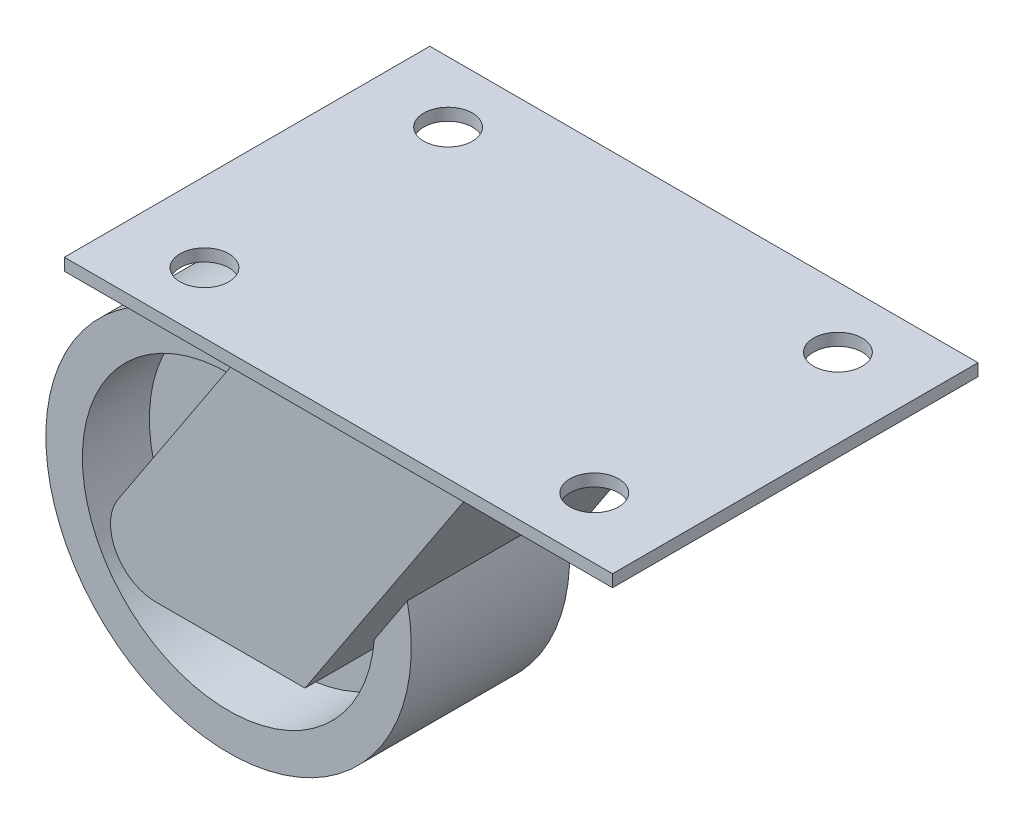
ISO-10303-21;
HEADER;
FILE_DESCRIPTION(('STEP AP214'),'2;1');
FILE_NAME('part.step','',(''),(''),'','','');
FILE_SCHEMA(('AUTOMOTIVE_DESIGN { 1 0 10303 214 1 1 1 1 }'));
ENDSEC;
DATA;
#1=APPLICATION_CONTEXT('core data for automotive mechanical design processes');
#2=APPLICATION_PROTOCOL_DEFINITION('international standard','automotive_design',2000,#1);
#3=PRODUCT_CONTEXT('',#1,'mechanical');
#4=PRODUCT('Part','Part','',(#3));
#5=PRODUCT_RELATED_PRODUCT_CATEGORY('part','',(#4));
#6=PRODUCT_DEFINITION_FORMATION('','',#4);
#7=PRODUCT_DEFINITION_CONTEXT('part definition',#1,'design');
#8=PRODUCT_DEFINITION('design','',#6,#7);
#9=PRODUCT_DEFINITION_SHAPE('','',#8);
#10=(LENGTH_UNIT() NAMED_UNIT(*) SI_UNIT(.MILLI.,.METRE.));
#11=(NAMED_UNIT(*) PLANE_ANGLE_UNIT() SI_UNIT($,.RADIAN.));
#12=(NAMED_UNIT(*) SI_UNIT($,.STERADIAN.) SOLID_ANGLE_UNIT());
#13=UNCERTAINTY_MEASURE_WITH_UNIT(LENGTH_MEASURE(1.E-05),#10,'distance_accuracy_value','');
#14=(GEOMETRIC_REPRESENTATION_CONTEXT(3) GLOBAL_UNCERTAINTY_ASSIGNED_CONTEXT((#13)) GLOBAL_UNIT_ASSIGNED_CONTEXT((#10,
#11,#12)) REPRESENTATION_CONTEXT('',''));
#15=CARTESIAN_POINT('',(0.,0.,0.));
#16=DIRECTION('',(0.,0.,1.));
#17=DIRECTION('',(1.,0.,0.));
#18=AXIS2_PLACEMENT_3D('',#15,#16,#17);
#19=CARTESIAN_POINT('',(10.7769033072078,-2.75667119831269,-11.));
#20=DIRECTION('',(0.835073819861632,-0.550137905785179,0.));
#21=DIRECTION('',(0.550137905785179,0.835073819861632,0.));
#22=AXIS2_PLACEMENT_3D('',#19,#20,#21);
#23=PLANE('',#22);
#24=DIRECTION('',(0.550137905785179,0.835073819861632,0.));
#25=VECTOR('',#24,1.);
#26=CARTESIAN_POINT('',(10.7769033072078,-2.75667119831269,-11.));
#27=LINE('',#26,#25);
#28=CARTESIAN_POINT('',(10.7769033072078,-2.75667119831269,-11.));
#29=VERTEX_POINT('',#28);
#30=CARTESIAN_POINT('',(26.4275500292333,21.,-11.));
#31=VERTEX_POINT('',#30);
#32=EDGE_CURVE('E279',#29,#31,#27,.T.);
#33=ORIENTED_EDGE('',*,*,#32,.T.);
#34=DIRECTION('',(0.,0.,1.));
#35=VECTOR('',#34,1.);
#36=CARTESIAN_POINT('',(26.4275500292333,21.,-11.));
#37=LINE('',#36,#35);
#38=CARTESIAN_POINT('',(26.4275500292333,21.,11.));
#39=VERTEX_POINT('',#38);
#40=EDGE_CURVE('E260',#31,#39,#37,.T.);
#41=ORIENTED_EDGE('',*,*,#40,.T.);
#42=DIRECTION('',(0.550137905785179,0.835073819861632,0.));
#43=VECTOR('',#42,1.);
#44=CARTESIAN_POINT('',(10.7769033072078,-2.75667119831269,11.));
#45=LINE('',#44,#43);
#46=CARTESIAN_POINT('',(10.7769033072078,-2.75667119831269,11.));
#47=VERTEX_POINT('',#46);
#48=EDGE_CURVE('E272',#47,#39,#45,.T.);
#49=ORIENTED_EDGE('',*,*,#48,.F.);
#50=DIRECTION('',(0.,0.,1.));
#51=VECTOR('',#50,1.);
#52=CARTESIAN_POINT('',(10.7769033072078,-2.75667119831269,-11.));
#53=LINE('',#52,#51);
#54=CARTESIAN_POINT('',(10.7769033072078,-2.75667119831269,1.));
#55=VERTEX_POINT('',#54);
#56=EDGE_CURVE('E302',#55,#47,#53,.T.);
#57=ORIENTED_EDGE('',*,*,#56,.F.);
#58=DIRECTION('',(0.550137905785179,0.835073819861632,0.));
#59=VECTOR('',#58,1.);
#60=CARTESIAN_POINT('',(8.78168566842124,-5.78528274744558,1.));
#61=LINE('',#60,#59);
#62=CARTESIAN_POINT('',(11.9616778927944,-0.958259875521329,1.));
#63=VERTEX_POINT('',#62);
#64=EDGE_CURVE('E60',#55,#63,#61,.T.);
#65=ORIENTED_EDGE('',*,*,#64,.T.);
#66=DIRECTION('',(0.,0.,-1.));
#67=VECTOR('',#66,1.);
#68=CARTESIAN_POINT('',(11.9616778927944,-0.958259875521333,6.5));
#69=LINE('',#68,#67);
#70=CARTESIAN_POINT('',(11.9616778927944,-0.958259875521333,6.5));
#71=VERTEX_POINT('',#70);
#72=EDGE_CURVE('E366',#63,#71,#69,.F.);
#73=ORIENTED_EDGE('',*,*,#72,.T.);
#74=DIRECTION('',(0.550137905785179,0.835073819861632,0.));
#75=VECTOR('',#74,1.);
#76=CARTESIAN_POINT('',(8.78168566842124,-5.78528274744558,6.5));
#77=LINE('',#76,#75);
#78=CARTESIAN_POINT('',(14.666168610277,3.14698241096535,6.5));
#79=VERTEX_POINT('',#78);
#80=EDGE_CURVE('E369',#71,#79,#77,.T.);
#81=ORIENTED_EDGE('',*,*,#80,.T.);
#82=DIRECTION('',(0.,0.,-1.));
#83=VECTOR('',#82,1.);
#84=CARTESIAN_POINT('',(14.666168610277,3.14698241096535,6.5));
#85=LINE('',#84,#83);
#86=CARTESIAN_POINT('',(14.666168610277,3.14698241096535,-6.5));
#87=VERTEX_POINT('',#86);
#88=EDGE_CURVE('E372',#87,#79,#85,.F.);
#89=ORIENTED_EDGE('',*,*,#88,.F.);
#90=DIRECTION('',(0.550137905785179,0.835073819861632,0.));
#91=VECTOR('',#90,1.);
#92=CARTESIAN_POINT('',(8.78168566842124,-5.78528274744558,-6.5));
#93=LINE('',#92,#91);
#94=CARTESIAN_POINT('',(11.9616778927944,-0.958259875521329,-6.5));
#95=VERTEX_POINT('',#94);
#96=EDGE_CURVE('E376',#95,#87,#93,.T.);
#97=ORIENTED_EDGE('',*,*,#96,.F.);
#98=DIRECTION('',(0.,0.,-1.));
#99=VECTOR('',#98,1.);
#100=CARTESIAN_POINT('',(11.9616778927944,-0.958259875521333,6.5));
#101=LINE('',#100,#99);
#102=CARTESIAN_POINT('',(11.9616778927944,-0.958259875521333,-1.));
#103=VERTEX_POINT('',#102);
#104=EDGE_CURVE('E380',#95,#103,#101,.F.);
#105=ORIENTED_EDGE('',*,*,#104,.T.);
#106=DIRECTION('',(0.550137905785179,0.835073819861632,0.));
#107=VECTOR('',#106,1.);
#108=CARTESIAN_POINT('',(8.78168566842124,-5.78528274744558,-1.));
#109=LINE('',#108,#107);
#110=CARTESIAN_POINT('',(10.7769033072078,-2.75667119831269,-1.));
#111=VERTEX_POINT('',#110);
#112=EDGE_CURVE('E383',#111,#103,#109,.T.);
#113=ORIENTED_EDGE('',*,*,#112,.F.);
#114=EDGE_CURVE('E297',#29,#111,#53,.T.);
#115=ORIENTED_EDGE('',*,*,#114,.F.);
#116=EDGE_LOOP('',(#33,#41,#49,#57,#65,#73,#81,#89,#97,#105,#113,#115));
#117=FACE_BOUND('',#116,.T.);
#118=ADVANCED_FACE('F51',(#117),#23,.T.);
#119=CARTESIAN_POINT('',(-4.58185860778798,2.97795286723007,-11.));
#120=DIRECTION('',(-0.835073819861632,0.550137905785179,0.));
#121=DIRECTION('',(-0.550137905785179,-0.835073819861632,0.));
#122=AXIS2_PLACEMENT_3D('',#119,#120,#121);
#123=PLANE('',#122);
#124=DIRECTION('',(-0.550137905785179,-0.835073819861632,0.));
#125=VECTOR('',#124,1.);
#126=CARTESIAN_POINT('',(-4.58185860778798,2.97795286723007,11.));
#127=LINE('',#126,#125);
#128=CARTESIAN_POINT('',(7.29087770817826,21.,11.));
#129=VERTEX_POINT('',#128);
#130=CARTESIAN_POINT('',(-4.58185860778798,2.97795286723007,11.));
#131=VERTEX_POINT('',#130);
#132=EDGE_CURVE('E267',#129,#131,#127,.T.);
#133=ORIENTED_EDGE('',*,*,#132,.F.);
#134=DIRECTION('',(0.,0.,-1.));
#135=VECTOR('',#134,1.);
#136=CARTESIAN_POINT('',(7.29087770817826,21.,-11.));
#137=LINE('',#136,#135);
#138=CARTESIAN_POINT('',(7.29087770817826,21.,-11.));
#139=VERTEX_POINT('',#138);
#140=EDGE_CURVE('E67',#129,#139,#137,.T.);
#141=ORIENTED_EDGE('',*,*,#140,.T.);
#142=DIRECTION('',(-0.550137905785179,-0.835073819861632,0.));
#143=VECTOR('',#142,1.);
#144=CARTESIAN_POINT('',(-4.58185860778798,2.97795286723007,-11.));
#145=LINE('',#144,#143);
#146=CARTESIAN_POINT('',(-4.58185860778798,2.97795286723007,-11.));
#147=VERTEX_POINT('',#146);
#148=EDGE_CURVE('E268',#139,#147,#145,.T.);
#149=ORIENTED_EDGE('',*,*,#148,.T.);
#150=DIRECTION('',(0.,0.,1.));
#151=VECTOR('',#150,1.);
#152=CARTESIAN_POINT('',(-4.58185860778798,2.97795286723007,-11.));
#153=LINE('',#152,#151);
#154=CARTESIAN_POINT('',(-4.58185860778798,2.97795286723007,-1.));
#155=VERTEX_POINT('',#154);
#156=EDGE_CURVE('E306',#147,#155,#153,.T.);
#157=ORIENTED_EDGE('',*,*,#156,.T.);
#158=DIRECTION('',(-0.550137905785179,-0.835073819861632,0.));
#159=VECTOR('',#158,1.);
#160=CARTESIAN_POINT('',(-4.56323994796898,3.00621479067191,-1.));
#161=LINE('',#160,#159);
#162=CARTESIAN_POINT('',(1.31421865650546,11.927817458483,-1.));
#163=VERTEX_POINT('',#162);
#164=EDGE_CURVE('E362',#163,#155,#161,.T.);
#165=ORIENTED_EDGE('',*,*,#164,.F.);
#166=DIRECTION('',(0.,0.,-1.));
#167=VECTOR('',#166,1.);
#168=CARTESIAN_POINT('',(1.31421865650546,11.927817458483,6.5));
#169=LINE('',#168,#167);
#170=CARTESIAN_POINT('',(1.31421865650547,11.927817458483,-6.5));
#171=VERTEX_POINT('',#170);
#172=EDGE_CURVE('E359',#163,#171,#169,.T.);
#173=ORIENTED_EDGE('',*,*,#172,.T.);
#174=DIRECTION('',(-0.550137905785179,-0.835073819861632,0.));
#175=VECTOR('',#174,1.);
#176=CARTESIAN_POINT('',(-4.56323994796898,3.00621479067191,-6.5));
#177=LINE('',#176,#175);
#178=CARTESIAN_POINT('',(3.12176549075575,14.6715568437956,-6.5));
#179=VERTEX_POINT('',#178);
#180=EDGE_CURVE('E355',#179,#171,#177,.T.);
#181=ORIENTED_EDGE('',*,*,#180,.F.);
#182=DIRECTION('',(0.,0.,-1.));
#183=VECTOR('',#182,1.);
#184=CARTESIAN_POINT('',(3.12176549075575,14.6715568437956,6.5));
#185=LINE('',#184,#183);
#186=CARTESIAN_POINT('',(3.12176549075575,14.6715568437956,6.5));
#187=VERTEX_POINT('',#186);
#188=EDGE_CURVE('E351',#187,#179,#185,.T.);
#189=ORIENTED_EDGE('',*,*,#188,.F.);
#190=DIRECTION('',(-0.550137905785179,-0.835073819861632,0.));
#191=VECTOR('',#190,1.);
#192=CARTESIAN_POINT('',(-4.56323994796898,3.00621479067191,6.5));
#193=LINE('',#192,#191);
#194=CARTESIAN_POINT('',(1.31421865650546,11.927817458483,6.5));
#195=VERTEX_POINT('',#194);
#196=EDGE_CURVE('E348',#187,#195,#193,.T.);
#197=ORIENTED_EDGE('',*,*,#196,.T.);
#198=DIRECTION('',(0.,0.,-1.));
#199=VECTOR('',#198,1.);
#200=CARTESIAN_POINT('',(1.31421865650546,11.927817458483,6.5));
#201=LINE('',#200,#199);
#202=CARTESIAN_POINT('',(1.31421865650547,11.927817458483,1.));
#203=VERTEX_POINT('',#202);
#204=EDGE_CURVE('E345',#195,#203,#201,.T.);
#205=ORIENTED_EDGE('',*,*,#204,.T.);
#206=DIRECTION('',(-0.550137905785179,-0.835073819861632,0.));
#207=VECTOR('',#206,1.);
#208=CARTESIAN_POINT('',(-4.56323994796898,3.00621479067191,1.));
#209=LINE('',#208,#207);
#210=CARTESIAN_POINT('',(-4.58185860778798,2.97795286723007,1.));
#211=VERTEX_POINT('',#210);
#212=EDGE_CURVE('E435',#203,#211,#209,.T.);
#213=ORIENTED_EDGE('',*,*,#212,.T.);
#214=EDGE_CURVE('E283',#211,#131,#153,.T.);
#215=ORIENTED_EDGE('',*,*,#214,.T.);
#216=EDGE_LOOP('',(#133,#141,#149,#157,#165,#173,#181,#189,#197,#205,#213,#215));
#217=FACE_BOUND('',#216,.T.);
#218=ADVANCED_FACE('F458',(#217),#123,.T.);
#219=CARTESIAN_POINT('',(0.,0.,-11.));
#220=DIRECTION('',(0.,0.,1.));
#221=DIRECTION('',(1.,0.,0.));
#222=AXIS2_PLACEMENT_3D('',#219,#220,#221);
#223=PLANE('',#222);
#224=DIRECTION('',(-1.,0.,0.));
#225=VECTOR('',#224,1.);
#226=CARTESIAN_POINT('',(0.,21.,-11.));
#227=LINE('',#226,#225);
#228=EDGE_CURVE('E264',#31,#139,#227,.T.);
#229=ORIENTED_EDGE('',*,*,#228,.F.);
#230=ORIENTED_EDGE('',*,*,#32,.F.);
#231=DIRECTION('',(1.,0.,0.));
#232=VECTOR('',#231,1.);
#233=CARTESIAN_POINT('',(-1.49256287093057,-2.75667119831269,-11.));
#234=LINE('',#233,#232);
#235=CARTESIAN_POINT('',(-1.49256287093057,-2.75667119831269,-11.));
#236=VERTEX_POINT('',#235);
#237=EDGE_CURVE('E275',#236,#29,#234,.T.);
#238=ORIENTED_EDGE('',*,*,#237,.F.);
#239=CARTESIAN_POINT('',(-1.49256287093057,0.94275711973624,-11.));
#240=DIRECTION('',(0.,0.,1.));
#241=DIRECTION('',(-1.,0.,0.));
#242=AXIS2_PLACEMENT_3D('',#239,#240,#241);
#243=CIRCLE('',#242,3.69942831804893);
#244=EDGE_CURVE('E271',#147,#236,#243,.T.);
#245=ORIENTED_EDGE('',*,*,#244,.F.);
#246=ORIENTED_EDGE('',*,*,#148,.F.);
#247=EDGE_LOOP('',(#229,#230,#238,#245,#246));
#248=FACE_BOUND('',#247,.T.);
#249=ADVANCED_FACE('F475',(#248),#223,.F.);
#250=CARTESIAN_POINT('',(0.,0.,11.));
#251=DIRECTION('',(0.,0.,1.));
#252=DIRECTION('',(1.,0.,0.));
#253=AXIS2_PLACEMENT_3D('',#250,#251,#252);
#254=PLANE('',#253);
#255=ORIENTED_EDGE('',*,*,#48,.T.);
#256=DIRECTION('',(-1.,0.,0.));
#257=VECTOR('',#256,1.);
#258=CARTESIAN_POINT('',(0.,21.,11.));
#259=LINE('',#258,#257);
#260=EDGE_CURVE('E12',#39,#129,#259,.T.);
#261=ORIENTED_EDGE('',*,*,#260,.T.);
#262=ORIENTED_EDGE('',*,*,#132,.T.);
#263=CARTESIAN_POINT('',(-1.49256287093057,0.94275711973624,11.));
#264=DIRECTION('',(0.,0.,1.));
#265=DIRECTION('',(-1.,0.,0.));
#266=AXIS2_PLACEMENT_3D('',#263,#264,#265);
#267=CIRCLE('',#266,3.69942831804893);
#268=CARTESIAN_POINT('',(-1.49256287093057,-2.75667119831269,11.));
#269=VERTEX_POINT('',#268);
#270=EDGE_CURVE('E286',#131,#269,#267,.T.);
#271=ORIENTED_EDGE('',*,*,#270,.T.);
#272=DIRECTION('',(1.,0.,0.));
#273=VECTOR('',#272,1.);
#274=CARTESIAN_POINT('',(-1.49256287093057,-2.75667119831269,11.));
#275=LINE('',#274,#273);
#276=EDGE_CURVE('E290',#269,#47,#275,.T.);
#277=ORIENTED_EDGE('',*,*,#276,.T.);
#278=EDGE_LOOP('',(#255,#261,#262,#271,#277));
#279=FACE_BOUND('',#278,.T.);
#280=ADVANCED_FACE('F470',(#279),#254,.T.);
#281=CARTESIAN_POINT('',(0.,0.,6.5));
#282=DIRECTION('',(0.,0.,-1.));
#283=DIRECTION('',(-1.,0.,0.));
#284=AXIS2_PLACEMENT_3D('',#281,#282,#283);
#285=CYLINDRICAL_SURFACE('',#284,12.);
#286=ORIENTED_EDGE('',*,*,#104,.F.);
#287=CARTESIAN_POINT('',(0.,0.,-6.5));
#288=DIRECTION('',(0.,0.,1.));
#289=DIRECTION('',(1.,0.,0.));
#290=AXIS2_PLACEMENT_3D('',#287,#288,#289);
#291=CIRCLE('',#290,12.);
#292=EDGE_CURVE('E407',#171,#95,#291,.T.);
#293=ORIENTED_EDGE('',*,*,#292,.F.);
#294=ORIENTED_EDGE('',*,*,#172,.F.);
#295=CARTESIAN_POINT('',(0.,0.,-1.));
#296=DIRECTION('',(0.,0.,1.));
#297=DIRECTION('',(1.,0.,0.));
#298=AXIS2_PLACEMENT_3D('',#295,#296,#297);
#299=CIRCLE('',#298,12.);
#300=EDGE_CURVE('E411',#163,#103,#299,.T.);
#301=ORIENTED_EDGE('',*,*,#300,.T.);
#302=EDGE_LOOP('',(#286,#293,#294,#301));
#303=FACE_BOUND('',#302,.T.);
#304=ADVANCED_FACE('F520',(#303),#285,.F.);
#305=CARTESIAN_POINT('',(0.,0.,6.5));
#306=DIRECTION('',(0.,0.,1.));
#307=DIRECTION('',(1.,0.,0.));
#308=AXIS2_PLACEMENT_3D('',#305,#306,#307);
#309=PLANE('',#308);
#310=ORIENTED_EDGE('',*,*,#80,.F.);
#311=CARTESIAN_POINT('',(0.,0.,6.5));
#312=DIRECTION('',(0.,0.,1.));
#313=DIRECTION('',(1.,0.,0.));
#314=AXIS2_PLACEMENT_3D('',#311,#312,#313);
#315=CIRCLE('',#314,12.);
#316=EDGE_CURVE('E402',#195,#71,#315,.T.);
#317=ORIENTED_EDGE('',*,*,#316,.F.);
#318=ORIENTED_EDGE('',*,*,#196,.F.);
#319=CARTESIAN_POINT('',(0.,0.,6.5));
#320=DIRECTION('',(0.,0.,1.));
#321=DIRECTION('',(1.,0.,0.));
#322=AXIS2_PLACEMENT_3D('',#319,#320,#321);
#323=CIRCLE('',#322,15.);
#324=EDGE_CURVE('E412',#187,#79,#323,.T.);
#325=ORIENTED_EDGE('',*,*,#324,.T.);
#326=EDGE_LOOP('',(#310,#317,#318,#325));
#327=FACE_BOUND('',#326,.T.);
#328=ADVANCED_FACE('F542',(#327),#309,.T.);
#329=CARTESIAN_POINT('',(0.,0.,-6.5));
#330=DIRECTION('',(0.,0.,1.));
#331=DIRECTION('',(1.,0.,0.));
#332=AXIS2_PLACEMENT_3D('',#329,#330,#331);
#333=PLANE('',#332);
#334=ORIENTED_EDGE('',*,*,#292,.T.);
#335=ORIENTED_EDGE('',*,*,#96,.T.);
#336=CARTESIAN_POINT('',(0.,0.,-6.5));
#337=DIRECTION('',(0.,0.,1.));
#338=DIRECTION('',(1.,0.,0.));
#339=AXIS2_PLACEMENT_3D('',#336,#337,#338);
#340=CIRCLE('',#339,15.);
#341=EDGE_CURVE('E406',#179,#87,#340,.T.);
#342=ORIENTED_EDGE('',*,*,#341,.F.);
#343=ORIENTED_EDGE('',*,*,#180,.T.);
#344=EDGE_LOOP('',(#334,#335,#342,#343));
#345=FACE_BOUND('',#344,.T.);
#346=ADVANCED_FACE('F544',(#345),#333,.F.);
#347=CARTESIAN_POINT('',(0.,0.,6.5));
#348=DIRECTION('',(0.,0.,-1.));
#349=DIRECTION('',(-1.,0.,0.));
#350=AXIS2_PLACEMENT_3D('',#347,#348,#349);
#351=CYLINDRICAL_SURFACE('',#350,15.);
#352=ORIENTED_EDGE('',*,*,#341,.T.);
#353=ORIENTED_EDGE('',*,*,#88,.T.);
#354=ORIENTED_EDGE('',*,*,#324,.F.);
#355=ORIENTED_EDGE('',*,*,#188,.T.);
#356=EDGE_LOOP('',(#352,#353,#354,#355));
#357=FACE_BOUND('',#356,.T.);
#358=ADVANCED_FACE('F53',(#357),#351,.T.);
#359=ORIENTED_EDGE('',*,*,#72,.F.);
#360=CARTESIAN_POINT('',(0.,0.,1.));
#361=DIRECTION('',(0.,0.,1.));
#362=DIRECTION('',(1.,0.,0.));
#363=AXIS2_PLACEMENT_3D('',#360,#361,#362);
#364=CIRCLE('',#363,12.);
#365=EDGE_CURVE('E401',#203,#63,#364,.T.);
#366=ORIENTED_EDGE('',*,*,#365,.F.);
#367=ORIENTED_EDGE('',*,*,#204,.F.);
#368=ORIENTED_EDGE('',*,*,#316,.T.);
#369=EDGE_LOOP('',(#359,#366,#367,#368));
#370=FACE_BOUND('',#369,.T.);
#371=ADVANCED_FACE('F448',(#370),#285,.F.);
#372=CARTESIAN_POINT('',(0.,0.,-1.));
#373=DIRECTION('',(0.,0.,1.));
#374=DIRECTION('',(1.,0.,0.));
#375=AXIS2_PLACEMENT_3D('',#372,#373,#374);
#376=PLANE('',#375);
#377=DIRECTION('',(1.,0.,0.));
#378=VECTOR('',#377,1.);
#379=CARTESIAN_POINT('',(0.,-2.75667119831269,-1.));
#380=LINE('',#379,#378);
#381=CARTESIAN_POINT('',(4.17142228794847,-2.75667119831269,-1.));
#382=VERTEX_POINT('',#381);
#383=EDGE_CURVE('E331',#382,#111,#380,.T.);
#384=ORIENTED_EDGE('',*,*,#383,.T.);
#385=ORIENTED_EDGE('',*,*,#112,.T.);
#386=ORIENTED_EDGE('',*,*,#300,.F.);
#387=ORIENTED_EDGE('',*,*,#164,.T.);
#388=CARTESIAN_POINT('',(-1.49256287093057,0.94275711973624,-1.));
#389=DIRECTION('',(0.,0.,1.));
#390=DIRECTION('',(1.,0.,0.));
#391=AXIS2_PLACEMENT_3D('',#388,#389,#390);
#392=CIRCLE('',#391,3.69942831804893);
#393=CARTESIAN_POINT('',(-4.99362707825869,-0.252366010551265,-1.));
#394=VERTEX_POINT('',#393);
#395=EDGE_CURVE('E313',#155,#394,#392,.T.);
#396=ORIENTED_EDGE('',*,*,#395,.T.);
#397=CARTESIAN_POINT('',(0.,0.,-1.));
#398=DIRECTION('',(0.,0.,1.));
#399=DIRECTION('',(1.,0.,0.));
#400=AXIS2_PLACEMENT_3D('',#397,#398,#399);
#401=CIRCLE('',#400,5.);
#402=EDGE_CURVE('E396',#382,#394,#401,.F.);
#403=ORIENTED_EDGE('',*,*,#402,.F.);
#404=EDGE_LOOP('',(#384,#385,#386,#387,#396,#403));
#405=FACE_BOUND('',#404,.T.);
#406=ADVANCED_FACE('F482',(#405),#376,.F.);
#407=CARTESIAN_POINT('',(0.,0.,1.));
#408=DIRECTION('',(0.,0.,1.));
#409=DIRECTION('',(1.,0.,0.));
#410=AXIS2_PLACEMENT_3D('',#407,#408,#409);
#411=PLANE('',#410);
#412=ORIENTED_EDGE('',*,*,#64,.F.);
#413=DIRECTION('',(1.,0.,0.));
#414=VECTOR('',#413,1.);
#415=CARTESIAN_POINT('',(0.,-2.75667119831269,1.));
#416=LINE('',#415,#414);
#417=CARTESIAN_POINT('',(4.17142228794847,-2.75667119831269,1.));
#418=VERTEX_POINT('',#417);
#419=EDGE_CURVE('E342',#418,#55,#416,.T.);
#420=ORIENTED_EDGE('',*,*,#419,.F.);
#421=CARTESIAN_POINT('',(0.,0.,1.));
#422=DIRECTION('',(0.,0.,1.));
#423=DIRECTION('',(1.,0.,0.));
#424=AXIS2_PLACEMENT_3D('',#421,#422,#423);
#425=CIRCLE('',#424,5.);
#426=CARTESIAN_POINT('',(-4.99362707825869,-0.252366010551265,1.));
#427=VERTEX_POINT('',#426);
#428=EDGE_CURVE('E392',#418,#427,#425,.F.);
#429=ORIENTED_EDGE('',*,*,#428,.T.);
#430=CARTESIAN_POINT('',(-1.49256287093057,0.94275711973624,1.));
#431=DIRECTION('',(0.,0.,1.));
#432=DIRECTION('',(1.,0.,0.));
#433=AXIS2_PLACEMENT_3D('',#430,#431,#432);
#434=CIRCLE('',#433,3.69942831804893);
#435=EDGE_CURVE('E324',#211,#427,#434,.T.);
#436=ORIENTED_EDGE('',*,*,#435,.F.);
#437=ORIENTED_EDGE('',*,*,#212,.F.);
#438=ORIENTED_EDGE('',*,*,#365,.T.);
#439=EDGE_LOOP('',(#412,#420,#429,#436,#437,#438));
#440=FACE_BOUND('',#439,.T.);
#441=ADVANCED_FACE('F452',(#440),#411,.T.);
#442=CARTESIAN_POINT('',(0.,0.,6.5));
#443=DIRECTION('',(0.,0.,1.));
#444=DIRECTION('',(1.,0.,0.));
#445=AXIS2_PLACEMENT_3D('',#442,#443,#444);
#446=PLANE('',#445);
#447=DIRECTION('',(1.,0.,0.));
#448=VECTOR('',#447,1.);
#449=CARTESIAN_POINT('',(0.,-2.75667119831269,6.5));
#450=LINE('',#449,#448);
#451=CARTESIAN_POINT('',(-1.49256287093057,-2.75667119831269,6.5));
#452=VERTEX_POINT('',#451);
#453=CARTESIAN_POINT('',(4.17142228794847,-2.75667119831269,6.5));
#454=VERTEX_POINT('',#453);
#455=EDGE_CURVE('E339',#452,#454,#450,.T.);
#456=ORIENTED_EDGE('',*,*,#455,.F.);
#457=CARTESIAN_POINT('',(-1.49256287093057,0.94275711973624,6.5));
#458=DIRECTION('',(0.,0.,1.));
#459=DIRECTION('',(1.,0.,0.));
#460=AXIS2_PLACEMENT_3D('',#457,#458,#459);
#461=CIRCLE('',#460,3.69942831804893);
#462=CARTESIAN_POINT('',(-4.99362707825869,-0.252366010551265,6.5));
#463=VERTEX_POINT('',#462);
#464=EDGE_CURVE('E321',#463,#452,#461,.T.);
#465=ORIENTED_EDGE('',*,*,#464,.F.);
#466=CARTESIAN_POINT('',(0.,0.,6.5));
#467=DIRECTION('',(0.,0.,1.));
#468=DIRECTION('',(1.,0.,0.));
#469=AXIS2_PLACEMENT_3D('',#466,#467,#468);
#470=CIRCLE('',#469,5.);
#471=EDGE_CURVE('E388',#463,#454,#470,.T.);
#472=ORIENTED_EDGE('',*,*,#471,.T.);
#473=EDGE_LOOP('',(#456,#465,#472));
#474=FACE_BOUND('',#473,.T.);
#475=ADVANCED_FACE('F522',(#474),#446,.T.);
#476=CARTESIAN_POINT('',(0.,0.,6.5));
#477=DIRECTION('',(0.,0.,-1.));
#478=DIRECTION('',(-1.,0.,0.));
#479=AXIS2_PLACEMENT_3D('',#476,#477,#478);
#480=CYLINDRICAL_SURFACE('',#479,5.);
#481=ORIENTED_EDGE('',*,*,#428,.F.);
#482=DIRECTION('',(0.,0.,-1.));
#483=VECTOR('',#482,1.);
#484=CARTESIAN_POINT('',(4.17142228794847,-2.75667119831269,6.5));
#485=LINE('',#484,#483);
#486=EDGE_CURVE('E335',#418,#454,#485,.F.);
#487=ORIENTED_EDGE('',*,*,#486,.T.);
#488=ORIENTED_EDGE('',*,*,#471,.F.);
#489=DIRECTION('',(0.,0.,1.));
#490=VECTOR('',#489,1.);
#491=CARTESIAN_POINT('',(-4.99362707825869,-0.252366010551265,0.));
#492=LINE('',#491,#490);
#493=EDGE_CURVE('E317',#463,#427,#492,.F.);
#494=ORIENTED_EDGE('',*,*,#493,.T.);
#495=EDGE_LOOP('',(#481,#487,#488,#494));
#496=FACE_BOUND('',#495,.T.);
#497=ADVANCED_FACE('F498',(#496),#480,.T.);
#498=CARTESIAN_POINT('',(0.,0.,-6.5));
#499=DIRECTION('',(0.,0.,1.));
#500=DIRECTION('',(1.,0.,0.));
#501=AXIS2_PLACEMENT_3D('',#498,#499,#500);
#502=CIRCLE('',#501,5.);
#503=CARTESIAN_POINT('',(-4.99362707825869,-0.252366010551265,-6.5));
#504=VERTEX_POINT('',#503);
#505=CARTESIAN_POINT('',(4.17142228794848,-2.75667119831269,-6.5));
#506=VERTEX_POINT('',#505);
#507=EDGE_CURVE('E387',#504,#506,#502,.T.);
#508=ORIENTED_EDGE('',*,*,#507,.T.);
#509=DIRECTION('',(0.,0.,-1.));
#510=VECTOR('',#509,1.);
#511=CARTESIAN_POINT('',(4.17142228794847,-2.75667119831269,6.5));
#512=LINE('',#511,#510);
#513=EDGE_CURVE('E327',#506,#382,#512,.F.);
#514=ORIENTED_EDGE('',*,*,#513,.T.);
#515=ORIENTED_EDGE('',*,*,#402,.T.);
#516=DIRECTION('',(0.,0.,1.));
#517=VECTOR('',#516,1.);
#518=CARTESIAN_POINT('',(-4.99362707825869,-0.252366010551265,0.));
#519=LINE('',#518,#517);
#520=EDGE_CURVE('E301',#394,#504,#519,.F.);
#521=ORIENTED_EDGE('',*,*,#520,.T.);
#522=EDGE_LOOP('',(#508,#514,#515,#521));
#523=FACE_BOUND('',#522,.T.);
#524=ADVANCED_FACE('F485',(#523),#480,.T.);
#525=CARTESIAN_POINT('',(0.,0.,-6.5));
#526=DIRECTION('',(0.,0.,1.));
#527=DIRECTION('',(1.,0.,0.));
#528=AXIS2_PLACEMENT_3D('',#525,#526,#527);
#529=PLANE('',#528);
#530=CARTESIAN_POINT('',(-1.49256287093057,0.94275711973624,-6.5));
#531=DIRECTION('',(0.,0.,1.));
#532=DIRECTION('',(1.,0.,0.));
#533=AXIS2_PLACEMENT_3D('',#530,#531,#532);
#534=CIRCLE('',#533,3.69942831804893);
#535=CARTESIAN_POINT('',(-1.49256287093057,-2.75667119831269,-6.5));
#536=VERTEX_POINT('',#535);
#537=EDGE_CURVE('E400',#504,#536,#534,.T.);
#538=ORIENTED_EDGE('',*,*,#537,.T.);
#539=DIRECTION('',(1.,0.,0.));
#540=VECTOR('',#539,1.);
#541=CARTESIAN_POINT('',(0.,-2.75667119831269,-6.5));
#542=LINE('',#541,#540);
#543=EDGE_CURVE('E431',#536,#506,#542,.T.);
#544=ORIENTED_EDGE('',*,*,#543,.T.);
#545=ORIENTED_EDGE('',*,*,#507,.F.);
#546=EDGE_LOOP('',(#538,#544,#545));
#547=FACE_BOUND('',#546,.T.);
#548=ADVANCED_FACE('F490',(#547),#529,.F.);
#549=CARTESIAN_POINT('',(-1.49256287093057,-2.75667119831269,-11.));
#550=DIRECTION('',(0.,-1.,0.));
#551=DIRECTION('',(0.,0.,-1.));
#552=AXIS2_PLACEMENT_3D('',#549,#550,#551);
#553=PLANE('',#552);
#554=ORIENTED_EDGE('',*,*,#383,.F.);
#555=ORIENTED_EDGE('',*,*,#513,.F.);
#556=ORIENTED_EDGE('',*,*,#543,.F.);
#557=DIRECTION('',(0.,0.,1.));
#558=VECTOR('',#557,1.);
#559=CARTESIAN_POINT('',(-1.49256287093057,-2.75667119831269,-11.));
#560=LINE('',#559,#558);
#561=EDGE_CURVE('E74',#236,#536,#560,.T.);
#562=ORIENTED_EDGE('',*,*,#561,.F.);
#563=ORIENTED_EDGE('',*,*,#237,.T.);
#564=ORIENTED_EDGE('',*,*,#114,.T.);
#565=EDGE_LOOP('',(#554,#555,#556,#562,#563,#564));
#566=FACE_BOUND('',#565,.T.);
#567=ADVANCED_FACE('F488',(#566),#553,.T.);
#568=CARTESIAN_POINT('',(-1.49256287093057,0.94275711973624,-11.));
#569=DIRECTION('',(0.,0.,1.));
#570=DIRECTION('',(1.,0.,0.));
#571=AXIS2_PLACEMENT_3D('',#568,#569,#570);
#572=CYLINDRICAL_SURFACE('',#571,3.69942831804893);
#573=ORIENTED_EDGE('',*,*,#395,.F.);
#574=ORIENTED_EDGE('',*,*,#156,.F.);
#575=ORIENTED_EDGE('',*,*,#244,.T.);
#576=ORIENTED_EDGE('',*,*,#561,.T.);
#577=ORIENTED_EDGE('',*,*,#537,.F.);
#578=ORIENTED_EDGE('',*,*,#520,.F.);
#579=EDGE_LOOP('',(#573,#574,#575,#576,#577,#578));
#580=FACE_BOUND('',#579,.T.);
#581=ADVANCED_FACE('F479',(#580),#572,.T.);
#582=ORIENTED_EDGE('',*,*,#486,.F.);
#583=ORIENTED_EDGE('',*,*,#419,.T.);
#584=ORIENTED_EDGE('',*,*,#56,.T.);
#585=ORIENTED_EDGE('',*,*,#276,.F.);
#586=EDGE_CURVE('E305',#452,#269,#560,.T.);
#587=ORIENTED_EDGE('',*,*,#586,.F.);
#588=ORIENTED_EDGE('',*,*,#455,.T.);
#589=EDGE_LOOP('',(#582,#583,#584,#585,#587,#588));
#590=FACE_BOUND('',#589,.T.);
#591=ADVANCED_FACE('F467',(#590),#553,.T.);
#592=ORIENTED_EDGE('',*,*,#214,.F.);
#593=ORIENTED_EDGE('',*,*,#435,.T.);
#594=ORIENTED_EDGE('',*,*,#493,.F.);
#595=ORIENTED_EDGE('',*,*,#464,.T.);
#596=ORIENTED_EDGE('',*,*,#586,.T.);
#597=ORIENTED_EDGE('',*,*,#270,.F.);
#598=EDGE_LOOP('',(#592,#593,#594,#595,#596,#597));
#599=FACE_BOUND('',#598,.T.);
#600=ADVANCED_FACE('F461',(#599),#572,.T.);
#601=CARTESIAN_POINT('',(0.,21.,0.));
#602=DIRECTION('',(0.,1.,0.));
#603=DIRECTION('',(0.,0.,1.));
#604=AXIS2_PLACEMENT_3D('',#601,#602,#603);
#605=PLANE('',#604);
#606=CARTESIAN_POINT('',(1.51966725791691,21.,9.99999999999999));
#607=DIRECTION('',(0.,1.,0.));
#608=DIRECTION('',(0.,0.,1.));
#609=AXIS2_PLACEMENT_3D('',#606,#607,#608);
#610=CIRCLE('',#609,2.00000000000001);
#611=CARTESIAN_POINT('',(1.51966725791691,21.,12.));
#612=VERTEX_POINT('',#611);
#613=EDGE_CURVE('E812',#612,#612,#610,.T.);
#614=ORIENTED_EDGE('',*,*,#613,.T.);
#615=EDGE_LOOP('',(#614));
#616=FACE_BOUND('',#615,.T.);
#617=CARTESIAN_POINT('',(33.5196672579169,21.,9.99999999999999));
#618=DIRECTION('',(0.,1.,0.));
#619=DIRECTION('',(0.,0.,-1.));
#620=AXIS2_PLACEMENT_3D('',#617,#618,#619);
#621=CIRCLE('',#620,2.);
#622=CARTESIAN_POINT('',(33.5196672579169,21.,7.99999999999999));
#623=VERTEX_POINT('',#622);
#624=EDGE_CURVE('E823',#623,#623,#621,.T.);
#625=ORIENTED_EDGE('',*,*,#624,.T.);
#626=EDGE_LOOP('',(#625));
#627=FACE_BOUND('',#626,.T.);
#628=CARTESIAN_POINT('',(1.51966725791691,21.,-9.99999999999997));
#629=DIRECTION('',(0.,1.,0.));
#630=DIRECTION('',(0.,0.,-1.));
#631=AXIS2_PLACEMENT_3D('',#628,#629,#630);
#632=CIRCLE('',#631,2.00000000000001);
#633=CARTESIAN_POINT('',(1.51966725791691,21.,-12.));
#634=VERTEX_POINT('',#633);
#635=EDGE_CURVE('E831',#634,#634,#632,.T.);
#636=ORIENTED_EDGE('',*,*,#635,.T.);
#637=EDGE_LOOP('',(#636));
#638=FACE_BOUND('',#637,.T.);
#639=CARTESIAN_POINT('',(33.5196672579169,21.,-10.));
#640=DIRECTION('',(0.,1.,0.));
#641=DIRECTION('',(0.,0.,1.));
#642=AXIS2_PLACEMENT_3D('',#639,#640,#641);
#643=CIRCLE('',#642,2.);
#644=CARTESIAN_POINT('',(33.5196672579169,21.,-8.));
#645=VERTEX_POINT('',#644);
#646=EDGE_CURVE('E245',#645,#645,#643,.T.);
#647=ORIENTED_EDGE('',*,*,#646,.T.);
#648=EDGE_LOOP('',(#647));
#649=FACE_BOUND('',#648,.T.);
#650=DIRECTION('',(0.,0.,1.));
#651=VECTOR('',#650,1.);
#652=CARTESIAN_POINT('',(-4.98033274208308,21.,15.));
#653=LINE('',#652,#651);
#654=CARTESIAN_POINT('',(-4.98033274208308,21.,-15.));
#655=VERTEX_POINT('',#654);
#656=CARTESIAN_POINT('',(-4.98033274208308,21.,15.));
#657=VERTEX_POINT('',#656);
#658=EDGE_CURVE('E219',#655,#657,#653,.T.);
#659=ORIENTED_EDGE('',*,*,#658,.F.);
#660=DIRECTION('',(-1.,0.,0.));
#661=VECTOR('',#660,1.);
#662=CARTESIAN_POINT('',(40.0196672579169,21.,-15.));
#663=LINE('',#662,#661);
#664=CARTESIAN_POINT('',(40.0196672579169,21.,-15.));
#665=VERTEX_POINT('',#664);
#666=EDGE_CURVE('E212',#665,#655,#663,.T.);
#667=ORIENTED_EDGE('',*,*,#666,.F.);
#668=DIRECTION('',(0.,0.,-1.));
#669=VECTOR('',#668,1.);
#670=CARTESIAN_POINT('',(40.0196672579169,21.,15.));
#671=LINE('',#670,#669);
#672=CARTESIAN_POINT('',(40.0196672579169,21.,15.));
#673=VERTEX_POINT('',#672);
#674=EDGE_CURVE('E222',#673,#665,#671,.T.);
#675=ORIENTED_EDGE('',*,*,#674,.F.);
#676=DIRECTION('',(1.,0.,0.));
#677=VECTOR('',#676,1.);
#678=CARTESIAN_POINT('',(40.0196672579169,21.,15.));
#679=LINE('',#678,#677);
#680=EDGE_CURVE('E203',#657,#673,#679,.T.);
#681=ORIENTED_EDGE('',*,*,#680,.F.);
#682=EDGE_LOOP('',(#659,#667,#675,#681));
#683=FACE_BOUND('',#682,.T.);
#684=ORIENTED_EDGE('',*,*,#40,.F.);
#685=ORIENTED_EDGE('',*,*,#228,.T.);
#686=ORIENTED_EDGE('',*,*,#140,.F.);
#687=ORIENTED_EDGE('',*,*,#260,.F.);
#688=EDGE_LOOP('',(#684,#685,#686,#687));
#689=FACE_BOUND('',#688,.T.);
#690=ADVANCED_FACE('F217',(#616,#627,#638,#649,#683,#689),#605,.F.);
#691=CARTESIAN_POINT('',(-4.98033274208308,21.,15.));
#692=DIRECTION('',(-1.,0.,0.));
#693=DIRECTION('',(0.,0.,1.));
#694=AXIS2_PLACEMENT_3D('',#691,#692,#693);
#695=PLANE('',#694);
#696=DIRECTION('',(0.,0.,1.));
#697=VECTOR('',#696,1.);
#698=CARTESIAN_POINT('',(-4.98033274208308,22.,15.));
#699=LINE('',#698,#697);
#700=CARTESIAN_POINT('',(-4.98033274208308,22.,-15.));
#701=VERTEX_POINT('',#700);
#702=CARTESIAN_POINT('',(-4.98033274208308,22.,15.));
#703=VERTEX_POINT('',#702);
#704=EDGE_CURVE('E242',#701,#703,#699,.T.);
#705=ORIENTED_EDGE('',*,*,#704,.F.);
#706=DIRECTION('',(0.,1.,0.));
#707=VECTOR('',#706,1.);
#708=CARTESIAN_POINT('',(-4.98033274208308,21.,-15.));
#709=LINE('',#708,#707);
#710=EDGE_CURVE('E226',#655,#701,#709,.T.);
#711=ORIENTED_EDGE('',*,*,#710,.F.);
#712=ORIENTED_EDGE('',*,*,#658,.T.);
#713=DIRECTION('',(0.,1.,0.));
#714=VECTOR('',#713,1.);
#715=CARTESIAN_POINT('',(-4.98033274208308,21.,15.));
#716=LINE('',#715,#714);
#717=EDGE_CURVE('E200',#657,#703,#716,.T.);
#718=ORIENTED_EDGE('',*,*,#717,.T.);
#719=EDGE_LOOP('',(#705,#711,#712,#718));
#720=FACE_BOUND('',#719,.T.);
#721=ADVANCED_FACE('F225',(#720),#695,.T.);
#722=CARTESIAN_POINT('',(40.0196672579169,21.,-15.));
#723=DIRECTION('',(0.,0.,-1.));
#724=DIRECTION('',(-1.,0.,0.));
#725=AXIS2_PLACEMENT_3D('',#722,#723,#724);
#726=PLANE('',#725);
#727=DIRECTION('',(-1.,0.,0.));
#728=VECTOR('',#727,1.);
#729=CARTESIAN_POINT('',(40.0196672579169,22.,-15.));
#730=LINE('',#729,#728);
#731=CARTESIAN_POINT('',(40.0196672579169,22.,-15.));
#732=VERTEX_POINT('',#731);
#733=EDGE_CURVE('E228',#732,#701,#730,.T.);
#734=ORIENTED_EDGE('',*,*,#733,.F.);
#735=DIRECTION('',(0.,1.,0.));
#736=VECTOR('',#735,1.);
#737=CARTESIAN_POINT('',(40.0196672579169,21.,-15.));
#738=LINE('',#737,#736);
#739=EDGE_CURVE('E253',#665,#732,#738,.T.);
#740=ORIENTED_EDGE('',*,*,#739,.F.);
#741=ORIENTED_EDGE('',*,*,#666,.T.);
#742=ORIENTED_EDGE('',*,*,#710,.T.);
#743=EDGE_LOOP('',(#734,#740,#741,#742));
#744=FACE_BOUND('',#743,.T.);
#745=ADVANCED_FACE('F710',(#744),#726,.T.);
#746=CARTESIAN_POINT('',(40.0196672579169,21.,15.));
#747=DIRECTION('',(1.,0.,0.));
#748=DIRECTION('',(0.,0.,-1.));
#749=AXIS2_PLACEMENT_3D('',#746,#747,#748);
#750=PLANE('',#749);
#751=DIRECTION('',(0.,0.,-1.));
#752=VECTOR('',#751,1.);
#753=CARTESIAN_POINT('',(40.0196672579169,22.,15.));
#754=LINE('',#753,#752);
#755=CARTESIAN_POINT('',(40.0196672579169,22.,15.));
#756=VERTEX_POINT('',#755);
#757=EDGE_CURVE('E232',#756,#732,#754,.T.);
#758=ORIENTED_EDGE('',*,*,#757,.F.);
#759=DIRECTION('',(0.,1.,0.));
#760=VECTOR('',#759,1.);
#761=CARTESIAN_POINT('',(40.0196672579169,21.,15.));
#762=LINE('',#761,#760);
#763=EDGE_CURVE('E211',#673,#756,#762,.T.);
#764=ORIENTED_EDGE('',*,*,#763,.F.);
#765=ORIENTED_EDGE('',*,*,#674,.T.);
#766=ORIENTED_EDGE('',*,*,#739,.T.);
#767=EDGE_LOOP('',(#758,#764,#765,#766));
#768=FACE_BOUND('',#767,.T.);
#769=ADVANCED_FACE('F718',(#768),#750,.T.);
#770=CARTESIAN_POINT('',(40.0196672579169,21.,15.));
#771=DIRECTION('',(0.,0.,1.));
#772=DIRECTION('',(1.,0.,0.));
#773=AXIS2_PLACEMENT_3D('',#770,#771,#772);
#774=PLANE('',#773);
#775=DIRECTION('',(1.,0.,0.));
#776=VECTOR('',#775,1.);
#777=CARTESIAN_POINT('',(40.0196672579169,22.,15.));
#778=LINE('',#777,#776);
#779=EDGE_CURVE('E205',#703,#756,#778,.T.);
#780=ORIENTED_EDGE('',*,*,#779,.F.);
#781=ORIENTED_EDGE('',*,*,#717,.F.);
#782=ORIENTED_EDGE('',*,*,#680,.T.);
#783=ORIENTED_EDGE('',*,*,#763,.T.);
#784=EDGE_LOOP('',(#780,#781,#782,#783));
#785=FACE_BOUND('',#784,.T.);
#786=ADVANCED_FACE('F202',(#785),#774,.T.);
#787=CARTESIAN_POINT('',(33.5196672579169,21.,-10.));
#788=DIRECTION('',(0.,1.,0.));
#789=DIRECTION('',(0.,0.,1.));
#790=AXIS2_PLACEMENT_3D('',#787,#788,#789);
#791=CYLINDRICAL_SURFACE('',#790,2.);
#792=ORIENTED_EDGE('',*,*,#646,.F.);
#793=EDGE_LOOP('',(#792));
#794=FACE_BOUND('',#793,.T.);
#795=CARTESIAN_POINT('',(33.5196672579169,22.,-10.));
#796=DIRECTION('',(0.,1.,0.));
#797=DIRECTION('',(0.,0.,1.));
#798=AXIS2_PLACEMENT_3D('',#795,#796,#797);
#799=CIRCLE('',#798,2.);
#800=CARTESIAN_POINT('',(33.5196672579169,22.,-8.));
#801=VERTEX_POINT('',#800);
#802=EDGE_CURVE('E235',#801,#801,#799,.T.);
#803=ORIENTED_EDGE('',*,*,#802,.T.);
#804=EDGE_LOOP('',(#803));
#805=FACE_BOUND('',#804,.T.);
#806=ADVANCED_FACE('F737',(#794,#805),#791,.F.);
#807=CARTESIAN_POINT('',(1.51966725791691,21.,-9.99999999999997));
#808=DIRECTION('',(0.,1.,0.));
#809=DIRECTION('',(0.,0.,1.));
#810=AXIS2_PLACEMENT_3D('',#807,#808,#809);
#811=CYLINDRICAL_SURFACE('',#810,2.00000000000001);
#812=ORIENTED_EDGE('',*,*,#635,.F.);
#813=EDGE_LOOP('',(#812));
#814=FACE_BOUND('',#813,.T.);
#815=CARTESIAN_POINT('',(1.51966725791691,22.,-9.99999999999997));
#816=DIRECTION('',(0.,1.,0.));
#817=DIRECTION('',(0.,0.,-1.));
#818=AXIS2_PLACEMENT_3D('',#815,#816,#817);
#819=CIRCLE('',#818,2.00000000000001);
#820=CARTESIAN_POINT('',(1.51966725791691,22.,-12.));
#821=VERTEX_POINT('',#820);
#822=EDGE_CURVE('E827',#821,#821,#819,.T.);
#823=ORIENTED_EDGE('',*,*,#822,.T.);
#824=EDGE_LOOP('',(#823));
#825=FACE_BOUND('',#824,.T.);
#826=ADVANCED_FACE('F745',(#814,#825),#811,.F.);
#827=CARTESIAN_POINT('',(33.5196672579169,21.,9.99999999999999));
#828=DIRECTION('',(0.,1.,0.));
#829=DIRECTION('',(0.,0.,1.));
#830=AXIS2_PLACEMENT_3D('',#827,#828,#829);
#831=CYLINDRICAL_SURFACE('',#830,2.);
#832=ORIENTED_EDGE('',*,*,#624,.F.);
#833=EDGE_LOOP('',(#832));
#834=FACE_BOUND('',#833,.T.);
#835=CARTESIAN_POINT('',(33.5196672579169,22.,9.99999999999999));
#836=DIRECTION('',(0.,1.,0.));
#837=DIRECTION('',(0.,0.,-1.));
#838=AXIS2_PLACEMENT_3D('',#835,#836,#837);
#839=CIRCLE('',#838,2.);
#840=CARTESIAN_POINT('',(33.5196672579169,22.,7.99999999999999));
#841=VERTEX_POINT('',#840);
#842=EDGE_CURVE('E820',#841,#841,#839,.T.);
#843=ORIENTED_EDGE('',*,*,#842,.T.);
#844=EDGE_LOOP('',(#843));
#845=FACE_BOUND('',#844,.T.);
#846=ADVANCED_FACE('F755',(#834,#845),#831,.F.);
#847=CARTESIAN_POINT('',(1.51966725791691,21.,9.99999999999999));
#848=DIRECTION('',(0.,1.,0.));
#849=DIRECTION('',(0.,0.,1.));
#850=AXIS2_PLACEMENT_3D('',#847,#848,#849);
#851=CYLINDRICAL_SURFACE('',#850,2.00000000000001);
#852=ORIENTED_EDGE('',*,*,#613,.F.);
#853=EDGE_LOOP('',(#852));
#854=FACE_BOUND('',#853,.T.);
#855=CARTESIAN_POINT('',(1.51966725791691,22.,9.99999999999999));
#856=DIRECTION('',(0.,1.,0.));
#857=DIRECTION('',(0.,0.,1.));
#858=AXIS2_PLACEMENT_3D('',#855,#856,#857);
#859=CIRCLE('',#858,2.00000000000001);
#860=CARTESIAN_POINT('',(1.51966725791691,22.,12.));
#861=VERTEX_POINT('',#860);
#862=EDGE_CURVE('E815',#861,#861,#859,.T.);
#863=ORIENTED_EDGE('',*,*,#862,.T.);
#864=EDGE_LOOP('',(#863));
#865=FACE_BOUND('',#864,.T.);
#866=ADVANCED_FACE('F516',(#854,#865),#851,.F.);
#867=CARTESIAN_POINT('',(7.94966725791692,22.,-11.));
#868=DIRECTION('',(0.,1.,0.));
#869=DIRECTION('',(0.,0.,1.));
#870=AXIS2_PLACEMENT_3D('',#867,#868,#869);
#871=PLANE('',#870);
#872=ORIENTED_EDGE('',*,*,#704,.T.);
#873=ORIENTED_EDGE('',*,*,#779,.T.);
#874=ORIENTED_EDGE('',*,*,#757,.T.);
#875=ORIENTED_EDGE('',*,*,#733,.T.);
#876=EDGE_LOOP('',(#872,#873,#874,#875));
#877=FACE_BOUND('',#876,.T.);
#878=ORIENTED_EDGE('',*,*,#802,.F.);
#879=EDGE_LOOP('',(#878));
#880=FACE_BOUND('',#879,.T.);
#881=ORIENTED_EDGE('',*,*,#822,.F.);
#882=EDGE_LOOP('',(#881));
#883=FACE_BOUND('',#882,.T.);
#884=ORIENTED_EDGE('',*,*,#842,.F.);
#885=EDGE_LOOP('',(#884));
#886=FACE_BOUND('',#885,.T.);
#887=ORIENTED_EDGE('',*,*,#862,.F.);
#888=EDGE_LOOP('',(#887));
#889=FACE_BOUND('',#888,.T.);
#890=ADVANCED_FACE('F513',(#877,#880,#883,#886,#889),#871,.T.);
#891=CLOSED_SHELL('',(#118,#218,#249,#280,#304,#328,#346,#358,#371,#406,#441,#475,#497,#524,
#548,#567,#581,#591,#600,#690,#721,#745,#769,#786,#806,#826,#846,#866,#890));
#892=MANIFOLD_SOLID_BREP('B2',#891);
#893=ADVANCED_BREP_SHAPE_REPRESENTATION('',(#18,#892),#14);
#894=SHAPE_DEFINITION_REPRESENTATION(#9,#893);
ENDSEC;
END-ISO-10303-21;
